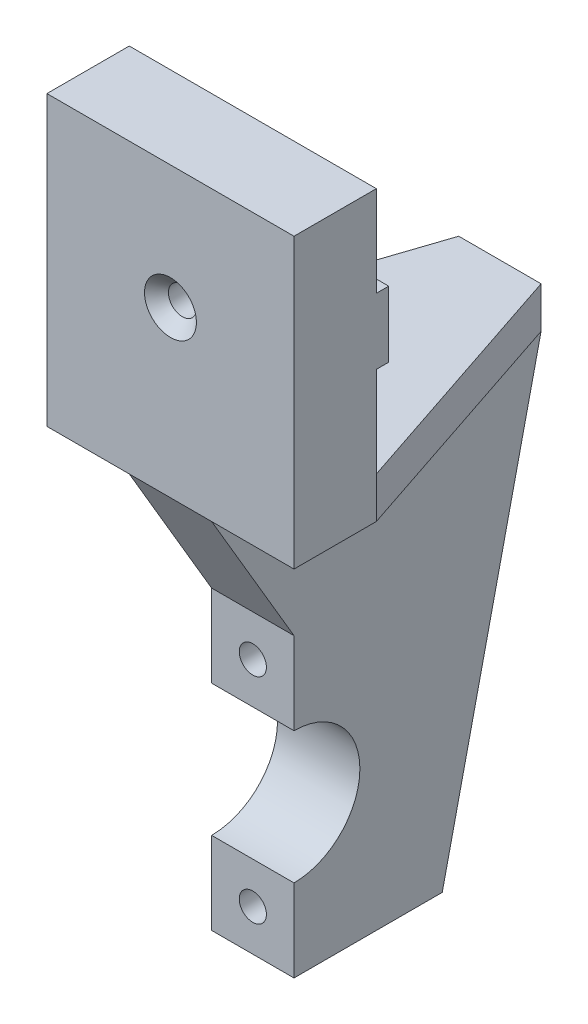
ISO-10303-21;
HEADER;
FILE_DESCRIPTION(('STEP AP214'),'2;1');
FILE_NAME('part.step','',(''),(''),'','','');
FILE_SCHEMA(('AUTOMOTIVE_DESIGN { 1 0 10303 214 1 1 1 1 }'));
ENDSEC;
DATA;
#1=APPLICATION_CONTEXT('core data for automotive mechanical design processes');
#2=APPLICATION_PROTOCOL_DEFINITION('international standard','automotive_design',2000,#1);
#3=PRODUCT_CONTEXT('',#1,'mechanical');
#4=PRODUCT('Part','Part','',(#3));
#5=PRODUCT_RELATED_PRODUCT_CATEGORY('part','',(#4));
#6=PRODUCT_DEFINITION_FORMATION('','',#4);
#7=PRODUCT_DEFINITION_CONTEXT('part definition',#1,'design');
#8=PRODUCT_DEFINITION('design','',#6,#7);
#9=PRODUCT_DEFINITION_SHAPE('','',#8);
#10=(LENGTH_UNIT() NAMED_UNIT(*) SI_UNIT(.MILLI.,.METRE.));
#11=(NAMED_UNIT(*) PLANE_ANGLE_UNIT() SI_UNIT($,.RADIAN.));
#12=(NAMED_UNIT(*) SI_UNIT($,.STERADIAN.) SOLID_ANGLE_UNIT());
#13=UNCERTAINTY_MEASURE_WITH_UNIT(LENGTH_MEASURE(1.E-05),#10,'distance_accuracy_value','');
#14=(GEOMETRIC_REPRESENTATION_CONTEXT(3) GLOBAL_UNCERTAINTY_ASSIGNED_CONTEXT((#13)) GLOBAL_UNIT_ASSIGNED_CONTEXT((#10,
#11,#12)) REPRESENTATION_CONTEXT('',''));
#15=CARTESIAN_POINT('',(0.,0.,0.));
#16=DIRECTION('',(0.,0.,1.));
#17=DIRECTION('',(1.,0.,0.));
#18=AXIS2_PLACEMENT_3D('',#15,#16,#17);
#19=CARTESIAN_POINT('',(0.,0.,0.));
#20=DIRECTION('',(0.,0.,1.));
#21=DIRECTION('',(1.,0.,0.));
#22=AXIS2_PLACEMENT_3D('',#19,#20,#21);
#23=PLANE('',#22);
#24=CARTESIAN_POINT('',(15.,15.,0.));
#25=DIRECTION('',(0.,0.,1.));
#26=DIRECTION('',(1.,0.,0.));
#27=AXIS2_PLACEMENT_3D('',#24,#25,#26);
#28=CIRCLE('',#27,1.7);
#29=CARTESIAN_POINT('',(16.7,15.,0.));
#30=VERTEX_POINT('',#29);
#31=EDGE_CURVE('E198',#30,#30,#28,.T.);
#32=ORIENTED_EDGE('',*,*,#31,.T.);
#33=EDGE_LOOP('',(#32));
#34=FACE_BOUND('',#33,.T.);
#35=DIRECTION('',(1.,0.,0.));
#36=VECTOR('',#35,1.);
#37=CARTESIAN_POINT('',(0.,19.,0.));
#38=LINE('',#37,#36);
#39=CARTESIAN_POINT('',(0.,19.,0.));
#40=VERTEX_POINT('',#39);
#41=CARTESIAN_POINT('',(5.,19.,0.));
#42=VERTEX_POINT('',#41);
#43=EDGE_CURVE('E229',#40,#42,#38,.T.);
#44=ORIENTED_EDGE('',*,*,#43,.F.);
#45=DIRECTION('',(0.,-1.,0.));
#46=VECTOR('',#45,1.);
#47=CARTESIAN_POINT('',(0.,30.,0.));
#48=LINE('',#47,#46);
#49=CARTESIAN_POINT('',(0.,30.,0.));
#50=VERTEX_POINT('',#49);
#51=EDGE_CURVE('E348',#50,#40,#48,.T.);
#52=ORIENTED_EDGE('',*,*,#51,.F.);
#53=DIRECTION('',(-1.,0.,0.));
#54=VECTOR('',#53,1.);
#55=CARTESIAN_POINT('',(0.,30.,0.));
#56=LINE('',#55,#54);
#57=CARTESIAN_POINT('',(30.,30.,0.));
#58=VERTEX_POINT('',#57);
#59=EDGE_CURVE('E343',#58,#50,#56,.T.);
#60=ORIENTED_EDGE('',*,*,#59,.F.);
#61=DIRECTION('',(0.,1.,0.));
#62=VECTOR('',#61,1.);
#63=CARTESIAN_POINT('',(30.,30.,0.));
#64=LINE('',#63,#62);
#65=CARTESIAN_POINT('',(30.,19.,0.));
#66=VERTEX_POINT('',#65);
#67=EDGE_CURVE('E354',#66,#58,#64,.T.);
#68=ORIENTED_EDGE('',*,*,#67,.F.);
#69=DIRECTION('',(1.,0.,0.));
#70=VECTOR('',#69,1.);
#71=CARTESIAN_POINT('',(0.,19.,0.));
#72=LINE('',#71,#70);
#73=CARTESIAN_POINT('',(25.,19.,0.));
#74=VERTEX_POINT('',#73);
#75=EDGE_CURVE('E364',#74,#66,#72,.T.);
#76=ORIENTED_EDGE('',*,*,#75,.F.);
#77=DIRECTION('',(0.,1.,0.));
#78=VECTOR('',#77,1.);
#79=CARTESIAN_POINT('',(25.,0.,0.));
#80=LINE('',#79,#78);
#81=CARTESIAN_POINT('',(25.,11.,0.));
#82=VERTEX_POINT('',#81);
#83=EDGE_CURVE('E367',#82,#74,#80,.T.);
#84=ORIENTED_EDGE('',*,*,#83,.F.);
#85=DIRECTION('',(-1.,0.,0.));
#86=VECTOR('',#85,1.);
#87=CARTESIAN_POINT('',(0.,11.,0.));
#88=LINE('',#87,#86);
#89=CARTESIAN_POINT('',(30.,11.,0.));
#90=VERTEX_POINT('',#89);
#91=EDGE_CURVE('E43',#90,#82,#88,.T.);
#92=ORIENTED_EDGE('',*,*,#91,.F.);
#93=CARTESIAN_POINT('',(30.,0.,0.));
#94=VERTEX_POINT('',#93);
#95=EDGE_CURVE('E355',#94,#90,#64,.T.);
#96=ORIENTED_EDGE('',*,*,#95,.F.);
#97=DIRECTION('',(1.,0.,0.));
#98=VECTOR('',#97,1.);
#99=CARTESIAN_POINT('',(0.,0.,0.));
#100=LINE('',#99,#98);
#101=CARTESIAN_POINT('',(0.,0.,0.));
#102=VERTEX_POINT('',#101);
#103=EDGE_CURVE('E351',#102,#94,#100,.T.);
#104=ORIENTED_EDGE('',*,*,#103,.F.);
#105=CARTESIAN_POINT('',(0.,11.,0.));
#106=VERTEX_POINT('',#105);
#107=EDGE_CURVE('E338',#106,#102,#48,.T.);
#108=ORIENTED_EDGE('',*,*,#107,.F.);
#109=DIRECTION('',(-1.,0.,0.));
#110=VECTOR('',#109,1.);
#111=CARTESIAN_POINT('',(0.,11.,0.));
#112=LINE('',#111,#110);
#113=CARTESIAN_POINT('',(5.,11.,0.));
#114=VERTEX_POINT('',#113);
#115=EDGE_CURVE('E53',#114,#106,#112,.T.);
#116=ORIENTED_EDGE('',*,*,#115,.F.);
#117=DIRECTION('',(0.,-1.,0.));
#118=VECTOR('',#117,1.);
#119=CARTESIAN_POINT('',(5.,0.,0.));
#120=LINE('',#119,#118);
#121=EDGE_CURVE('E11',#42,#114,#120,.T.);
#122=ORIENTED_EDGE('',*,*,#121,.F.);
#123=EDGE_LOOP('',(#44,#52,#60,#68,#76,#84,#92,#96,#104,#108,#116,#122));
#124=FACE_BOUND('',#123,.T.);
#125=ADVANCED_FACE('F35',(#34,#124),#23,.F.);
#126=CARTESIAN_POINT('',(0.,-5.,0.));
#127=DIRECTION('',(0.,-1.,0.));
#128=DIRECTION('',(0.,0.,-1.));
#129=AXIS2_PLACEMENT_3D('',#126,#127,#128);
#130=PLANE('',#129);
#131=DIRECTION('',(0.316227766016838,0.,-0.948683298050514));
#132=VECTOR('',#131,1.);
#133=CARTESIAN_POINT('',(0.,-5.,0.));
#134=LINE('',#133,#132);
#135=CARTESIAN_POINT('',(0.,-5.,0.));
#136=VERTEX_POINT('',#135);
#137=CARTESIAN_POINT('',(10.,-5.,-30.));
#138=VERTEX_POINT('',#137);
#139=EDGE_CURVE('E307',#136,#138,#134,.T.);
#140=ORIENTED_EDGE('',*,*,#139,.T.);
#141=DIRECTION('',(0.,0.,1.));
#142=VECTOR('',#141,1.);
#143=CARTESIAN_POINT('',(10.,-5.,10.));
#144=LINE('',#143,#142);
#145=CARTESIAN_POINT('',(10.,-5.,10.));
#146=VERTEX_POINT('',#145);
#147=EDGE_CURVE('E281',#138,#146,#144,.T.);
#148=ORIENTED_EDGE('',*,*,#147,.T.);
#149=DIRECTION('',(-1.,0.,0.));
#150=VECTOR('',#149,1.);
#151=CARTESIAN_POINT('',(0.,-5.,10.));
#152=LINE('',#151,#150);
#153=CARTESIAN_POINT('',(0.,-5.,10.));
#154=VERTEX_POINT('',#153);
#155=EDGE_CURVE('E318',#146,#154,#152,.T.);
#156=ORIENTED_EDGE('',*,*,#155,.T.);
#157=DIRECTION('',(0.,0.,-1.));
#158=VECTOR('',#157,1.);
#159=CARTESIAN_POINT('',(0.,-5.,10.));
#160=LINE('',#159,#158);
#161=EDGE_CURVE('E304',#154,#136,#160,.T.);
#162=ORIENTED_EDGE('',*,*,#161,.T.);
#163=EDGE_LOOP('',(#140,#148,#156,#162));
#164=FACE_BOUND('',#163,.T.);
#165=ADVANCED_FACE('F438',(#164),#130,.T.);
#166=CARTESIAN_POINT('',(0.,30.,10.));
#167=DIRECTION('',(1.,0.,0.));
#168=DIRECTION('',(0.,0.,-1.));
#169=AXIS2_PLACEMENT_3D('',#166,#167,#168);
#170=PLANE('',#169);
#171=ORIENTED_EDGE('',*,*,#51,.T.);
#172=DIRECTION('',(0.,0.,1.));
#173=VECTOR('',#172,1.);
#174=CARTESIAN_POINT('',(0.,19.,-1.5));
#175=LINE('',#174,#173);
#176=CARTESIAN_POINT('',(0.,19.,-1.5));
#177=VERTEX_POINT('',#176);
#178=EDGE_CURVE('E225',#177,#40,#175,.T.);
#179=ORIENTED_EDGE('',*,*,#178,.F.);
#180=DIRECTION('',(0.,1.,0.));
#181=VECTOR('',#180,1.);
#182=CARTESIAN_POINT('',(0.,19.,-1.5));
#183=LINE('',#182,#181);
#184=CARTESIAN_POINT('',(0.,11.,-1.5));
#185=VERTEX_POINT('',#184);
#186=EDGE_CURVE('E207',#185,#177,#183,.T.);
#187=ORIENTED_EDGE('',*,*,#186,.F.);
#188=DIRECTION('',(0.,0.,1.));
#189=VECTOR('',#188,1.);
#190=CARTESIAN_POINT('',(0.,11.,-1.5));
#191=LINE('',#190,#189);
#192=EDGE_CURVE('E216',#185,#106,#191,.T.);
#193=ORIENTED_EDGE('',*,*,#192,.T.);
#194=ORIENTED_EDGE('',*,*,#107,.T.);
#195=DIRECTION('',(0.,1.,0.));
#196=VECTOR('',#195,1.);
#197=CARTESIAN_POINT('',(0.,-5.,0.));
#198=LINE('',#197,#196);
#199=EDGE_CURVE('E335',#136,#102,#198,.T.);
#200=ORIENTED_EDGE('',*,*,#199,.F.);
#201=ORIENTED_EDGE('',*,*,#161,.F.);
#202=DIRECTION('',(0.,-1.,0.));
#203=VECTOR('',#202,1.);
#204=CARTESIAN_POINT('',(0.,30.,10.));
#205=LINE('',#204,#203);
#206=CARTESIAN_POINT('',(0.,30.,10.));
#207=VERTEX_POINT('',#206);
#208=EDGE_CURVE('E339',#207,#154,#205,.T.);
#209=ORIENTED_EDGE('',*,*,#208,.F.);
#210=DIRECTION('',(0.,0.,-1.));
#211=VECTOR('',#210,1.);
#212=CARTESIAN_POINT('',(0.,30.,10.));
#213=LINE('',#212,#211);
#214=EDGE_CURVE('E347',#207,#50,#213,.T.);
#215=ORIENTED_EDGE('',*,*,#214,.T.);
#216=EDGE_LOOP('',(#171,#179,#187,#193,#194,#200,#201,#209,#215));
#217=FACE_BOUND('',#216,.T.);
#218=ADVANCED_FACE('F37',(#217),#170,.F.);
#219=CARTESIAN_POINT('',(30.,30.,10.));
#220=DIRECTION('',(-1.,0.,0.));
#221=DIRECTION('',(0.,-1.,0.));
#222=AXIS2_PLACEMENT_3D('',#219,#220,#221);
#223=PLANE('',#222);
#224=ORIENTED_EDGE('',*,*,#95,.T.);
#225=DIRECTION('',(0.,0.,1.));
#226=VECTOR('',#225,1.);
#227=CARTESIAN_POINT('',(30.,11.,-1.5));
#228=LINE('',#227,#226);
#229=CARTESIAN_POINT('',(30.,11.,-1.5));
#230=VERTEX_POINT('',#229);
#231=EDGE_CURVE('E249',#230,#90,#228,.T.);
#232=ORIENTED_EDGE('',*,*,#231,.F.);
#233=DIRECTION('',(0.,-1.,0.));
#234=VECTOR('',#233,1.);
#235=CARTESIAN_POINT('',(30.,19.,-1.5));
#236=LINE('',#235,#234);
#237=CARTESIAN_POINT('',(30.,19.,-1.5));
#238=VERTEX_POINT('',#237);
#239=EDGE_CURVE('E231',#238,#230,#236,.T.);
#240=ORIENTED_EDGE('',*,*,#239,.F.);
#241=DIRECTION('',(0.,0.,1.));
#242=VECTOR('',#241,1.);
#243=CARTESIAN_POINT('',(30.,19.,-1.5));
#244=LINE('',#243,#242);
#245=EDGE_CURVE('E240',#238,#66,#244,.T.);
#246=ORIENTED_EDGE('',*,*,#245,.T.);
#247=ORIENTED_EDGE('',*,*,#67,.T.);
#248=DIRECTION('',(0.,0.,-1.));
#249=VECTOR('',#248,1.);
#250=CARTESIAN_POINT('',(30.,30.,10.));
#251=LINE('',#250,#249);
#252=CARTESIAN_POINT('',(30.,30.,10.));
#253=VERTEX_POINT('',#252);
#254=EDGE_CURVE('E361',#253,#58,#251,.T.);
#255=ORIENTED_EDGE('',*,*,#254,.F.);
#256=DIRECTION('',(0.,1.,0.));
#257=VECTOR('',#256,1.);
#258=CARTESIAN_POINT('',(30.,30.,10.));
#259=LINE('',#258,#257);
#260=CARTESIAN_POINT('',(30.,-5.,10.));
#261=VERTEX_POINT('',#260);
#262=EDGE_CURVE('E342',#261,#253,#259,.T.);
#263=ORIENTED_EDGE('',*,*,#262,.F.);
#264=DIRECTION('',(0.,0.,1.));
#265=VECTOR('',#264,1.);
#266=CARTESIAN_POINT('',(30.,-5.,10.));
#267=LINE('',#266,#265);
#268=CARTESIAN_POINT('',(30.,-5.,0.));
#269=VERTEX_POINT('',#268);
#270=EDGE_CURVE('E315',#269,#261,#267,.T.);
#271=ORIENTED_EDGE('',*,*,#270,.F.);
#272=DIRECTION('',(0.,1.,0.));
#273=VECTOR('',#272,1.);
#274=CARTESIAN_POINT('',(30.,-5.,0.));
#275=LINE('',#274,#273);
#276=EDGE_CURVE('E321',#269,#94,#275,.T.);
#277=ORIENTED_EDGE('',*,*,#276,.T.);
#278=EDGE_LOOP('',(#224,#232,#240,#246,#247,#255,#263,#271,#277));
#279=FACE_BOUND('',#278,.T.);
#280=ADVANCED_FACE('F384',(#279),#223,.F.);
#281=CARTESIAN_POINT('',(0.,30.,10.));
#282=DIRECTION('',(0.,-1.,0.));
#283=DIRECTION('',(0.,0.,-1.));
#284=AXIS2_PLACEMENT_3D('',#281,#282,#283);
#285=PLANE('',#284);
#286=ORIENTED_EDGE('',*,*,#59,.T.);
#287=ORIENTED_EDGE('',*,*,#214,.F.);
#288=DIRECTION('',(-1.,0.,0.));
#289=VECTOR('',#288,1.);
#290=CARTESIAN_POINT('',(0.,30.,10.));
#291=LINE('',#290,#289);
#292=EDGE_CURVE('E345',#253,#207,#291,.T.);
#293=ORIENTED_EDGE('',*,*,#292,.F.);
#294=ORIENTED_EDGE('',*,*,#254,.T.);
#295=EDGE_LOOP('',(#286,#287,#293,#294));
#296=FACE_BOUND('',#295,.T.);
#297=ADVANCED_FACE('F425',(#296),#285,.F.);
#298=CARTESIAN_POINT('',(0.,0.,10.));
#299=DIRECTION('',(0.,0.,1.));
#300=DIRECTION('',(1.,0.,0.));
#301=AXIS2_PLACEMENT_3D('',#298,#299,#300);
#302=PLANE('',#301);
#303=CARTESIAN_POINT('',(15.,15.,10.));
#304=DIRECTION('',(0.,0.,1.));
#305=DIRECTION('',(1.,0.,0.));
#306=AXIS2_PLACEMENT_3D('',#303,#304,#305);
#307=CIRCLE('',#306,3.15);
#308=CARTESIAN_POINT('',(18.15,15.,10.));
#309=VERTEX_POINT('',#308);
#310=EDGE_CURVE('E204',#309,#309,#307,.T.);
#311=ORIENTED_EDGE('',*,*,#310,.F.);
#312=EDGE_LOOP('',(#311));
#313=FACE_BOUND('',#312,.T.);
#314=ORIENTED_EDGE('',*,*,#208,.T.);
#315=ORIENTED_EDGE('',*,*,#155,.F.);
#316=DIRECTION('',(-1.,0.,0.));
#317=VECTOR('',#316,1.);
#318=CARTESIAN_POINT('',(20.,-5.,10.));
#319=LINE('',#318,#317);
#320=CARTESIAN_POINT('',(20.,-5.,10.));
#321=VERTEX_POINT('',#320);
#322=EDGE_CURVE('E291',#321,#146,#319,.T.);
#323=ORIENTED_EDGE('',*,*,#322,.F.);
#324=EDGE_CURVE('E319',#261,#321,#152,.T.);
#325=ORIENTED_EDGE('',*,*,#324,.F.);
#326=ORIENTED_EDGE('',*,*,#262,.T.);
#327=ORIENTED_EDGE('',*,*,#292,.T.);
#328=EDGE_LOOP('',(#314,#315,#323,#325,#326,#327));
#329=FACE_BOUND('',#328,.T.);
#330=ADVANCED_FACE('F449',(#313,#329),#302,.T.);
#331=CARTESIAN_POINT('',(0.,0.,0.));
#332=DIRECTION('',(0.,-1.,0.));
#333=DIRECTION('',(0.,0.,-1.));
#334=AXIS2_PLACEMENT_3D('',#331,#332,#333);
#335=PLANE('',#334);
#336=DIRECTION('',(0.316227766016838,0.,-0.948683298050514));
#337=VECTOR('',#336,1.);
#338=CARTESIAN_POINT('',(0.,0.,0.));
#339=LINE('',#338,#337);
#340=CARTESIAN_POINT('',(10.,0.,-30.));
#341=VERTEX_POINT('',#340);
#342=EDGE_CURVE('E303',#102,#341,#339,.T.);
#343=ORIENTED_EDGE('',*,*,#342,.F.);
#344=ORIENTED_EDGE('',*,*,#103,.T.);
#345=DIRECTION('',(0.316227766016838,0.,0.948683298050514));
#346=VECTOR('',#345,1.);
#347=CARTESIAN_POINT('',(20.,0.,-30.));
#348=LINE('',#347,#346);
#349=CARTESIAN_POINT('',(20.,0.,-30.));
#350=VERTEX_POINT('',#349);
#351=EDGE_CURVE('E308',#350,#94,#348,.T.);
#352=ORIENTED_EDGE('',*,*,#351,.F.);
#353=DIRECTION('',(1.,0.,0.));
#354=VECTOR('',#353,1.);
#355=CARTESIAN_POINT('',(10.,0.,-30.));
#356=LINE('',#355,#354);
#357=EDGE_CURVE('E323',#341,#350,#356,.T.);
#358=ORIENTED_EDGE('',*,*,#357,.F.);
#359=EDGE_LOOP('',(#343,#344,#352,#358));
#360=FACE_BOUND('',#359,.T.);
#361=ADVANCED_FACE('F391',(#360),#335,.F.);
#362=CARTESIAN_POINT('',(0.,-5.,0.));
#363=DIRECTION('',(0.948683298050514,0.,0.316227766016838));
#364=DIRECTION('',(0.316227766016838,0.,-0.948683298050514));
#365=AXIS2_PLACEMENT_3D('',#362,#363,#364);
#366=PLANE('',#365);
#367=ORIENTED_EDGE('',*,*,#342,.T.);
#368=DIRECTION('',(0.,1.,0.));
#369=VECTOR('',#368,1.);
#370=CARTESIAN_POINT('',(10.,-5.,-30.));
#371=LINE('',#370,#369);
#372=EDGE_CURVE('E332',#138,#341,#371,.T.);
#373=ORIENTED_EDGE('',*,*,#372,.F.);
#374=ORIENTED_EDGE('',*,*,#139,.F.);
#375=ORIENTED_EDGE('',*,*,#199,.T.);
#376=EDGE_LOOP('',(#367,#373,#374,#375));
#377=FACE_BOUND('',#376,.T.);
#378=ADVANCED_FACE('F402',(#377),#366,.F.);
#379=CARTESIAN_POINT('',(10.,-5.,-30.));
#380=DIRECTION('',(0.,0.,1.));
#381=DIRECTION('',(1.,0.,0.));
#382=AXIS2_PLACEMENT_3D('',#379,#380,#381);
#383=PLANE('',#382);
#384=ORIENTED_EDGE('',*,*,#357,.T.);
#385=DIRECTION('',(0.,1.,0.));
#386=VECTOR('',#385,1.);
#387=CARTESIAN_POINT('',(20.,-5.,-30.));
#388=LINE('',#387,#386);
#389=CARTESIAN_POINT('',(20.,-5.,-30.));
#390=VERTEX_POINT('',#389);
#391=EDGE_CURVE('E329',#390,#350,#388,.T.);
#392=ORIENTED_EDGE('',*,*,#391,.F.);
#393=DIRECTION('',(1.,0.,0.));
#394=VECTOR('',#393,1.);
#395=CARTESIAN_POINT('',(10.,-5.,-30.));
#396=LINE('',#395,#394);
#397=EDGE_CURVE('E310',#138,#390,#396,.T.);
#398=ORIENTED_EDGE('',*,*,#397,.F.);
#399=ORIENTED_EDGE('',*,*,#372,.T.);
#400=EDGE_LOOP('',(#384,#392,#398,#399));
#401=FACE_BOUND('',#400,.T.);
#402=ADVANCED_FACE('F399',(#401),#383,.F.);
#403=CARTESIAN_POINT('',(20.,-5.,-30.));
#404=DIRECTION('',(-0.948683298050514,0.,0.316227766016838));
#405=DIRECTION('',(0.316227766016838,0.,0.948683298050514));
#406=AXIS2_PLACEMENT_3D('',#403,#404,#405);
#407=PLANE('',#406);
#408=ORIENTED_EDGE('',*,*,#351,.T.);
#409=ORIENTED_EDGE('',*,*,#276,.F.);
#410=DIRECTION('',(0.316227766016838,0.,0.948683298050514));
#411=VECTOR('',#410,1.);
#412=CARTESIAN_POINT('',(20.,-5.,-30.));
#413=LINE('',#412,#411);
#414=EDGE_CURVE('E313',#390,#269,#413,.T.);
#415=ORIENTED_EDGE('',*,*,#414,.F.);
#416=ORIENTED_EDGE('',*,*,#391,.T.);
#417=EDGE_LOOP('',(#408,#409,#415,#416));
#418=FACE_BOUND('',#417,.T.);
#419=ADVANCED_FACE('F394',(#418),#407,.F.);
#420=DIRECTION('',(0.,0.,1.));
#421=VECTOR('',#420,1.);
#422=CARTESIAN_POINT('',(20.,-5.,10.));
#423=LINE('',#422,#421);
#424=EDGE_CURVE('E264',#390,#321,#423,.T.);
#425=ORIENTED_EDGE('',*,*,#424,.F.);
#426=ORIENTED_EDGE('',*,*,#414,.T.);
#427=ORIENTED_EDGE('',*,*,#270,.T.);
#428=ORIENTED_EDGE('',*,*,#324,.T.);
#429=EDGE_LOOP('',(#425,#426,#427,#428));
#430=FACE_BOUND('',#429,.T.);
#431=ADVANCED_FACE('F446',(#430),#130,.T.);
#432=CARTESIAN_POINT('',(20.,-40.,0.));
#433=DIRECTION('',(-1.,0.,0.));
#434=DIRECTION('',(0.,-1.,0.));
#435=AXIS2_PLACEMENT_3D('',#432,#433,#434);
#436=CYLINDRICAL_SURFACE('',#435,8.);
#437=CARTESIAN_POINT('',(10.,-40.,0.));
#438=DIRECTION('',(-1.,0.,0.));
#439=DIRECTION('',(0.,1.,0.));
#440=AXIS2_PLACEMENT_3D('',#437,#438,#439);
#441=CIRCLE('',#440,8.);
#442=CARTESIAN_POINT('',(10.,-32.,0.));
#443=VERTEX_POINT('',#442);
#444=CARTESIAN_POINT('',(10.,-48.,0.));
#445=VERTEX_POINT('',#444);
#446=EDGE_CURVE('E252',#443,#445,#441,.T.);
#447=ORIENTED_EDGE('',*,*,#446,.T.);
#448=DIRECTION('',(-1.,0.,0.));
#449=VECTOR('',#448,1.);
#450=CARTESIAN_POINT('',(20.,-48.,0.));
#451=LINE('',#450,#449);
#452=CARTESIAN_POINT('',(20.,-48.,0.));
#453=VERTEX_POINT('',#452);
#454=EDGE_CURVE('E300',#453,#445,#451,.T.);
#455=ORIENTED_EDGE('',*,*,#454,.F.);
#456=CARTESIAN_POINT('',(20.,-40.,0.));
#457=DIRECTION('',(-1.,0.,0.));
#458=DIRECTION('',(0.,1.,0.));
#459=AXIS2_PLACEMENT_3D('',#456,#457,#458);
#460=CIRCLE('',#459,8.);
#461=CARTESIAN_POINT('',(20.,-32.,0.));
#462=VERTEX_POINT('',#461);
#463=EDGE_CURVE('E253',#462,#453,#460,.T.);
#464=ORIENTED_EDGE('',*,*,#463,.F.);
#465=DIRECTION('',(-1.,0.,0.));
#466=VECTOR('',#465,1.);
#467=CARTESIAN_POINT('',(20.,-32.,0.));
#468=LINE('',#467,#466);
#469=EDGE_CURVE('E271',#462,#443,#468,.T.);
#470=ORIENTED_EDGE('',*,*,#469,.T.);
#471=EDGE_LOOP('',(#447,#455,#464,#470));
#472=FACE_BOUND('',#471,.T.);
#473=ADVANCED_FACE('F501',(#472),#436,.F.);
#474=CARTESIAN_POINT('',(20.,-48.,0.));
#475=DIRECTION('',(0.,0.,-1.));
#476=DIRECTION('',(0.,1.,0.));
#477=AXIS2_PLACEMENT_3D('',#474,#475,#476);
#478=PLANE('',#477);
#479=CARTESIAN_POINT('',(15.,-53.,0.));
#480=DIRECTION('',(0.,0.,1.));
#481=DIRECTION('',(1.,0.,0.));
#482=AXIS2_PLACEMENT_3D('',#479,#480,#481);
#483=CIRCLE('',#482,1.65);
#484=CARTESIAN_POINT('',(16.65,-53.,0.));
#485=VERTEX_POINT('',#484);
#486=EDGE_CURVE('E195',#485,#485,#483,.T.);
#487=ORIENTED_EDGE('',*,*,#486,.F.);
#488=EDGE_LOOP('',(#487));
#489=FACE_BOUND('',#488,.T.);
#490=DIRECTION('',(0.,-1.,0.));
#491=VECTOR('',#490,1.);
#492=CARTESIAN_POINT('',(10.,-48.,0.));
#493=LINE('',#492,#491);
#494=CARTESIAN_POINT('',(10.,-58.,0.));
#495=VERTEX_POINT('',#494);
#496=EDGE_CURVE('E274',#445,#495,#493,.T.);
#497=ORIENTED_EDGE('',*,*,#496,.T.);
#498=DIRECTION('',(-1.,0.,0.));
#499=VECTOR('',#498,1.);
#500=CARTESIAN_POINT('',(20.,-58.,0.));
#501=LINE('',#500,#499);
#502=CARTESIAN_POINT('',(20.,-58.,0.));
#503=VERTEX_POINT('',#502);
#504=EDGE_CURVE('E297',#503,#495,#501,.T.);
#505=ORIENTED_EDGE('',*,*,#504,.F.);
#506=DIRECTION('',(0.,-1.,0.));
#507=VECTOR('',#506,1.);
#508=CARTESIAN_POINT('',(20.,-48.,0.));
#509=LINE('',#508,#507);
#510=EDGE_CURVE('E256',#453,#503,#509,.T.);
#511=ORIENTED_EDGE('',*,*,#510,.F.);
#512=ORIENTED_EDGE('',*,*,#454,.T.);
#513=EDGE_LOOP('',(#497,#505,#511,#512));
#514=FACE_BOUND('',#513,.T.);
#515=ADVANCED_FACE('F509',(#489,#514),#478,.F.);
#516=CARTESIAN_POINT('',(20.,-58.,0.));
#517=DIRECTION('',(0.,1.,0.));
#518=DIRECTION('',(-1.,0.,0.));
#519=AXIS2_PLACEMENT_3D('',#516,#517,#518);
#520=PLANE('',#519);
#521=DIRECTION('',(0.,0.,-1.));
#522=VECTOR('',#521,1.);
#523=CARTESIAN_POINT('',(10.,-58.,0.));
#524=LINE('',#523,#522);
#525=CARTESIAN_POINT('',(10.,-58.,-18.));
#526=VERTEX_POINT('',#525);
#527=EDGE_CURVE('E276',#495,#526,#524,.T.);
#528=ORIENTED_EDGE('',*,*,#527,.T.);
#529=DIRECTION('',(-1.,0.,0.));
#530=VECTOR('',#529,1.);
#531=CARTESIAN_POINT('',(20.,-58.,-18.));
#532=LINE('',#531,#530);
#533=CARTESIAN_POINT('',(20.,-58.,-18.));
#534=VERTEX_POINT('',#533);
#535=EDGE_CURVE('E294',#534,#526,#532,.T.);
#536=ORIENTED_EDGE('',*,*,#535,.F.);
#537=DIRECTION('',(0.,0.,-1.));
#538=VECTOR('',#537,1.);
#539=CARTESIAN_POINT('',(20.,-58.,0.));
#540=LINE('',#539,#538);
#541=EDGE_CURVE('E259',#503,#534,#540,.T.);
#542=ORIENTED_EDGE('',*,*,#541,.F.);
#543=ORIENTED_EDGE('',*,*,#504,.T.);
#544=EDGE_LOOP('',(#528,#536,#542,#543));
#545=FACE_BOUND('',#544,.T.);
#546=ADVANCED_FACE('F517',(#545),#520,.F.);
#547=CARTESIAN_POINT('',(20.,-58.,-18.));
#548=DIRECTION('',(0.,0.220825652597795,0.975313298973595));
#549=DIRECTION('',(0.,-0.975313298973595,0.220825652597795));
#550=AXIS2_PLACEMENT_3D('',#547,#548,#549);
#551=PLANE('',#550);
#552=DIRECTION('',(0.,0.975313298973595,-0.220825652597795));
#553=VECTOR('',#552,1.);
#554=CARTESIAN_POINT('',(10.,-58.,-18.));
#555=LINE('',#554,#553);
#556=EDGE_CURVE('E278',#526,#138,#555,.T.);
#557=ORIENTED_EDGE('',*,*,#556,.T.);
#558=ORIENTED_EDGE('',*,*,#397,.T.);
#559=DIRECTION('',(0.,0.975313298973595,-0.220825652597795));
#560=VECTOR('',#559,1.);
#561=CARTESIAN_POINT('',(20.,-58.,-18.));
#562=LINE('',#561,#560);
#563=EDGE_CURVE('E261',#534,#390,#562,.T.);
#564=ORIENTED_EDGE('',*,*,#563,.F.);
#565=ORIENTED_EDGE('',*,*,#535,.T.);
#566=EDGE_LOOP('',(#557,#558,#564,#565));
#567=FACE_BOUND('',#566,.T.);
#568=ADVANCED_FACE('F522',(#567),#551,.F.);
#569=CARTESIAN_POINT('',(20.,-5.,10.));
#570=DIRECTION('',(0.,0.507020126563394,-0.861934215157769));
#571=DIRECTION('',(0.,0.86193421515777,0.507020126563394));
#572=AXIS2_PLACEMENT_3D('',#569,#570,#571);
#573=PLANE('',#572);
#574=DIRECTION('',(0.,-0.86193421515777,-0.507020126563394));
#575=VECTOR('',#574,1.);
#576=CARTESIAN_POINT('',(10.,-5.,10.));
#577=LINE('',#576,#575);
#578=CARTESIAN_POINT('',(10.,-22.,0.));
#579=VERTEX_POINT('',#578);
#580=EDGE_CURVE('E283',#146,#579,#577,.T.);
#581=ORIENTED_EDGE('',*,*,#580,.T.);
#582=DIRECTION('',(-1.,0.,0.));
#583=VECTOR('',#582,1.);
#584=CARTESIAN_POINT('',(20.,-22.,0.));
#585=LINE('',#584,#583);
#586=CARTESIAN_POINT('',(20.,-22.,0.));
#587=VERTEX_POINT('',#586);
#588=EDGE_CURVE('E288',#587,#579,#585,.T.);
#589=ORIENTED_EDGE('',*,*,#588,.F.);
#590=DIRECTION('',(0.,-0.86193421515777,-0.507020126563394));
#591=VECTOR('',#590,1.);
#592=CARTESIAN_POINT('',(20.,-5.,10.));
#593=LINE('',#592,#591);
#594=EDGE_CURVE('E267',#321,#587,#593,.T.);
#595=ORIENTED_EDGE('',*,*,#594,.F.);
#596=ORIENTED_EDGE('',*,*,#322,.T.);
#597=EDGE_LOOP('',(#581,#589,#595,#596));
#598=FACE_BOUND('',#597,.T.);
#599=ADVANCED_FACE('F532',(#598),#573,.F.);
#600=CARTESIAN_POINT('',(20.,-32.,0.));
#601=DIRECTION('',(0.,0.,-1.));
#602=DIRECTION('',(-1.,0.,0.));
#603=AXIS2_PLACEMENT_3D('',#600,#601,#602);
#604=PLANE('',#603);
#605=CARTESIAN_POINT('',(15.,-27.,0.));
#606=DIRECTION('',(0.,0.,1.));
#607=DIRECTION('',(1.,0.,0.));
#608=AXIS2_PLACEMENT_3D('',#605,#606,#607);
#609=CIRCLE('',#608,1.65);
#610=CARTESIAN_POINT('',(16.65,-27.,0.));
#611=VERTEX_POINT('',#610);
#612=EDGE_CURVE('E187',#611,#611,#609,.T.);
#613=ORIENTED_EDGE('',*,*,#612,.F.);
#614=EDGE_LOOP('',(#613));
#615=FACE_BOUND('',#614,.T.);
#616=DIRECTION('',(0.,-1.,0.));
#617=VECTOR('',#616,1.);
#618=CARTESIAN_POINT('',(10.,-32.,0.));
#619=LINE('',#618,#617);
#620=EDGE_CURVE('E257',#579,#443,#619,.T.);
#621=ORIENTED_EDGE('',*,*,#620,.T.);
#622=ORIENTED_EDGE('',*,*,#469,.F.);
#623=DIRECTION('',(0.,-1.,0.));
#624=VECTOR('',#623,1.);
#625=CARTESIAN_POINT('',(20.,-32.,0.));
#626=LINE('',#625,#624);
#627=EDGE_CURVE('E269',#587,#462,#626,.T.);
#628=ORIENTED_EDGE('',*,*,#627,.F.);
#629=ORIENTED_EDGE('',*,*,#588,.T.);
#630=EDGE_LOOP('',(#621,#622,#628,#629));
#631=FACE_BOUND('',#630,.T.);
#632=ADVANCED_FACE('F542',(#615,#631),#604,.F.);
#633=CARTESIAN_POINT('',(20.,-40.,0.));
#634=DIRECTION('',(1.,0.,0.));
#635=DIRECTION('',(0.,1.,0.));
#636=AXIS2_PLACEMENT_3D('',#633,#634,#635);
#637=PLANE('',#636);
#638=ORIENTED_EDGE('',*,*,#463,.T.);
#639=ORIENTED_EDGE('',*,*,#510,.T.);
#640=ORIENTED_EDGE('',*,*,#541,.T.);
#641=ORIENTED_EDGE('',*,*,#563,.T.);
#642=ORIENTED_EDGE('',*,*,#424,.T.);
#643=ORIENTED_EDGE('',*,*,#594,.T.);
#644=ORIENTED_EDGE('',*,*,#627,.T.);
#645=EDGE_LOOP('',(#638,#639,#640,#641,#642,#643,#644));
#646=FACE_BOUND('',#645,.T.);
#647=ADVANCED_FACE('F550',(#646),#637,.T.);
#648=CARTESIAN_POINT('',(10.,-40.,0.));
#649=DIRECTION('',(1.,0.,0.));
#650=DIRECTION('',(0.,1.,0.));
#651=AXIS2_PLACEMENT_3D('',#648,#649,#650);
#652=PLANE('',#651);
#653=ORIENTED_EDGE('',*,*,#446,.F.);
#654=ORIENTED_EDGE('',*,*,#620,.F.);
#655=ORIENTED_EDGE('',*,*,#580,.F.);
#656=ORIENTED_EDGE('',*,*,#147,.F.);
#657=ORIENTED_EDGE('',*,*,#556,.F.);
#658=ORIENTED_EDGE('',*,*,#527,.F.);
#659=ORIENTED_EDGE('',*,*,#496,.F.);
#660=EDGE_LOOP('',(#653,#654,#655,#656,#657,#658,#659));
#661=FACE_BOUND('',#660,.T.);
#662=ADVANCED_FACE('F554',(#661),#652,.F.);
#663=CARTESIAN_POINT('',(30.,11.,-1.5));
#664=DIRECTION('',(0.,1.,0.));
#665=DIRECTION('',(0.,0.,1.));
#666=AXIS2_PLACEMENT_3D('',#663,#664,#665);
#667=PLANE('',#666);
#668=ORIENTED_EDGE('',*,*,#231,.T.);
#669=ORIENTED_EDGE('',*,*,#91,.T.);
#670=DIRECTION('',(0.,0.,1.));
#671=VECTOR('',#670,1.);
#672=CARTESIAN_POINT('',(25.,11.,-1.5));
#673=LINE('',#672,#671);
#674=CARTESIAN_POINT('',(25.,11.,-1.5));
#675=VERTEX_POINT('',#674);
#676=EDGE_CURVE('E246',#675,#82,#673,.T.);
#677=ORIENTED_EDGE('',*,*,#676,.F.);
#678=DIRECTION('',(-1.,0.,0.));
#679=VECTOR('',#678,1.);
#680=CARTESIAN_POINT('',(30.,11.,-1.5));
#681=LINE('',#680,#679);
#682=EDGE_CURVE('E234',#230,#675,#681,.T.);
#683=ORIENTED_EDGE('',*,*,#682,.F.);
#684=EDGE_LOOP('',(#668,#669,#677,#683));
#685=FACE_BOUND('',#684,.T.);
#686=ADVANCED_FACE('F372',(#685),#667,.F.);
#687=CARTESIAN_POINT('',(25.,19.,-1.5));
#688=DIRECTION('',(1.,0.,0.));
#689=DIRECTION('',(0.,1.,0.));
#690=AXIS2_PLACEMENT_3D('',#687,#688,#689);
#691=PLANE('',#690);
#692=ORIENTED_EDGE('',*,*,#676,.T.);
#693=ORIENTED_EDGE('',*,*,#83,.T.);
#694=DIRECTION('',(0.,0.,1.));
#695=VECTOR('',#694,1.);
#696=CARTESIAN_POINT('',(25.,19.,-1.5));
#697=LINE('',#696,#695);
#698=CARTESIAN_POINT('',(25.,19.,-1.5));
#699=VERTEX_POINT('',#698);
#700=EDGE_CURVE('E243',#699,#74,#697,.T.);
#701=ORIENTED_EDGE('',*,*,#700,.F.);
#702=DIRECTION('',(0.,1.,0.));
#703=VECTOR('',#702,1.);
#704=CARTESIAN_POINT('',(25.,19.,-1.5));
#705=LINE('',#704,#703);
#706=EDGE_CURVE('E236',#675,#699,#705,.T.);
#707=ORIENTED_EDGE('',*,*,#706,.F.);
#708=EDGE_LOOP('',(#692,#693,#701,#707));
#709=FACE_BOUND('',#708,.T.);
#710=ADVANCED_FACE('F376',(#709),#691,.F.);
#711=CARTESIAN_POINT('',(30.,19.,-1.5));
#712=DIRECTION('',(0.,-1.,0.));
#713=DIRECTION('',(0.,0.,-1.));
#714=AXIS2_PLACEMENT_3D('',#711,#712,#713);
#715=PLANE('',#714);
#716=ORIENTED_EDGE('',*,*,#700,.T.);
#717=ORIENTED_EDGE('',*,*,#75,.T.);
#718=ORIENTED_EDGE('',*,*,#245,.F.);
#719=DIRECTION('',(1.,0.,0.));
#720=VECTOR('',#719,1.);
#721=CARTESIAN_POINT('',(30.,19.,-1.5));
#722=LINE('',#721,#720);
#723=EDGE_CURVE('E238',#699,#238,#722,.T.);
#724=ORIENTED_EDGE('',*,*,#723,.F.);
#725=EDGE_LOOP('',(#716,#717,#718,#724));
#726=FACE_BOUND('',#725,.T.);
#727=ADVANCED_FACE('F428',(#726),#715,.F.);
#728=CARTESIAN_POINT('',(0.,0.,-1.5));
#729=DIRECTION('',(0.,0.,-1.));
#730=DIRECTION('',(-1.,0.,0.));
#731=AXIS2_PLACEMENT_3D('',#728,#729,#730);
#732=PLANE('',#731);
#733=ORIENTED_EDGE('',*,*,#239,.T.);
#734=ORIENTED_EDGE('',*,*,#682,.T.);
#735=ORIENTED_EDGE('',*,*,#706,.T.);
#736=ORIENTED_EDGE('',*,*,#723,.T.);
#737=EDGE_LOOP('',(#733,#734,#735,#736));
#738=FACE_BOUND('',#737,.T.);
#739=ADVANCED_FACE('F380',(#738),#732,.T.);
#740=CARTESIAN_POINT('',(5.,19.,-1.5));
#741=DIRECTION('',(-1.,0.,0.));
#742=DIRECTION('',(0.,-1.,0.));
#743=AXIS2_PLACEMENT_3D('',#740,#741,#742);
#744=PLANE('',#743);
#745=DIRECTION('',(0.,0.,1.));
#746=VECTOR('',#745,1.);
#747=CARTESIAN_POINT('',(5.,19.,-1.5));
#748=LINE('',#747,#746);
#749=CARTESIAN_POINT('',(5.,19.,-1.5));
#750=VERTEX_POINT('',#749);
#751=EDGE_CURVE('E222',#750,#42,#748,.T.);
#752=ORIENTED_EDGE('',*,*,#751,.T.);
#753=ORIENTED_EDGE('',*,*,#121,.T.);
#754=DIRECTION('',(0.,0.,1.));
#755=VECTOR('',#754,1.);
#756=CARTESIAN_POINT('',(5.,11.,-1.5));
#757=LINE('',#756,#755);
#758=CARTESIAN_POINT('',(5.,11.,-1.5));
#759=VERTEX_POINT('',#758);
#760=EDGE_CURVE('E219',#759,#114,#757,.T.);
#761=ORIENTED_EDGE('',*,*,#760,.F.);
#762=DIRECTION('',(0.,-1.,0.));
#763=VECTOR('',#762,1.);
#764=CARTESIAN_POINT('',(5.,19.,-1.5));
#765=LINE('',#764,#763);
#766=EDGE_CURVE('E212',#750,#759,#765,.T.);
#767=ORIENTED_EDGE('',*,*,#766,.F.);
#768=EDGE_LOOP('',(#752,#753,#761,#767));
#769=FACE_BOUND('',#768,.T.);
#770=ADVANCED_FACE('F415',(#769),#744,.F.);
#771=CARTESIAN_POINT('',(0.,19.,-1.5));
#772=DIRECTION('',(0.,-1.,0.));
#773=DIRECTION('',(0.,0.,-1.));
#774=AXIS2_PLACEMENT_3D('',#771,#772,#773);
#775=PLANE('',#774);
#776=ORIENTED_EDGE('',*,*,#178,.T.);
#777=ORIENTED_EDGE('',*,*,#43,.T.);
#778=ORIENTED_EDGE('',*,*,#751,.F.);
#779=DIRECTION('',(1.,0.,0.));
#780=VECTOR('',#779,1.);
#781=CARTESIAN_POINT('',(0.,19.,-1.5));
#782=LINE('',#781,#780);
#783=EDGE_CURVE('E210',#177,#750,#782,.T.);
#784=ORIENTED_EDGE('',*,*,#783,.F.);
#785=EDGE_LOOP('',(#776,#777,#778,#784));
#786=FACE_BOUND('',#785,.T.);
#787=ADVANCED_FACE('F418',(#786),#775,.F.);
#788=CARTESIAN_POINT('',(0.,11.,-1.5));
#789=DIRECTION('',(0.,1.,0.));
#790=DIRECTION('',(-1.,0.,0.));
#791=AXIS2_PLACEMENT_3D('',#788,#789,#790);
#792=PLANE('',#791);
#793=ORIENTED_EDGE('',*,*,#760,.T.);
#794=ORIENTED_EDGE('',*,*,#115,.T.);
#795=ORIENTED_EDGE('',*,*,#192,.F.);
#796=DIRECTION('',(-1.,0.,0.));
#797=VECTOR('',#796,1.);
#798=CARTESIAN_POINT('',(0.,11.,-1.5));
#799=LINE('',#798,#797);
#800=EDGE_CURVE('E214',#759,#185,#799,.T.);
#801=ORIENTED_EDGE('',*,*,#800,.F.);
#802=EDGE_LOOP('',(#793,#794,#795,#801));
#803=FACE_BOUND('',#802,.T.);
#804=ADVANCED_FACE('F410',(#803),#792,.F.);
#805=CARTESIAN_POINT('',(0.,0.,-1.5));
#806=DIRECTION('',(0.,0.,1.));
#807=DIRECTION('',(1.,0.,0.));
#808=AXIS2_PLACEMENT_3D('',#805,#806,#807);
#809=PLANE('',#808);
#810=ORIENTED_EDGE('',*,*,#186,.T.);
#811=ORIENTED_EDGE('',*,*,#783,.T.);
#812=ORIENTED_EDGE('',*,*,#766,.T.);
#813=ORIENTED_EDGE('',*,*,#800,.T.);
#814=EDGE_LOOP('',(#810,#811,#812,#813));
#815=FACE_BOUND('',#814,.T.);
#816=ADVANCED_FACE('F612',(#815),#809,.F.);
#817=CARTESIAN_POINT('',(15.,15.,10.));
#818=DIRECTION('',(0.,0.,1.));
#819=DIRECTION('',(1.,0.,0.));
#820=AXIS2_PLACEMENT_3D('',#817,#818,#819);
#821=CONICAL_SURFACE('',#820,3.15,0.785398163397448);
#822=CARTESIAN_POINT('',(15.,15.,8.55));
#823=DIRECTION('',(0.,0.,1.));
#824=DIRECTION('',(1.,0.,0.));
#825=AXIS2_PLACEMENT_3D('',#822,#823,#824);
#826=CIRCLE('',#825,1.7);
#827=CARTESIAN_POINT('',(16.7,15.,8.55));
#828=VERTEX_POINT('',#827);
#829=EDGE_CURVE('E201',#828,#828,#826,.T.);
#830=ORIENTED_EDGE('',*,*,#829,.F.);
#831=EDGE_LOOP('',(#830));
#832=FACE_BOUND('',#831,.T.);
#833=ORIENTED_EDGE('',*,*,#310,.T.);
#834=EDGE_LOOP('',(#833));
#835=FACE_BOUND('',#834,.T.);
#836=ADVANCED_FACE('F620',(#832,#835),#821,.F.);
#837=CARTESIAN_POINT('',(15.,15.,10.));
#838=DIRECTION('',(0.,0.,1.));
#839=DIRECTION('',(1.,0.,0.));
#840=AXIS2_PLACEMENT_3D('',#837,#838,#839);
#841=CYLINDRICAL_SURFACE('',#840,1.7);
#842=ORIENTED_EDGE('',*,*,#31,.F.);
#843=EDGE_LOOP('',(#842));
#844=FACE_BOUND('',#843,.T.);
#845=ORIENTED_EDGE('',*,*,#829,.T.);
#846=EDGE_LOOP('',(#845));
#847=FACE_BOUND('',#846,.T.);
#848=ADVANCED_FACE('F644',(#844,#847),#841,.F.);
#849=CARTESIAN_POINT('',(15.,-53.,0.));
#850=DIRECTION('',(0.,0.,1.));
#851=DIRECTION('',(1.,0.,0.));
#852=AXIS2_PLACEMENT_3D('',#849,#850,#851);
#853=CYLINDRICAL_SURFACE('',#852,1.65);
#854=CARTESIAN_POINT('',(15.,-53.,-10.));
#855=DIRECTION('',(0.,0.,1.));
#856=DIRECTION('',(1.,0.,0.));
#857=AXIS2_PLACEMENT_3D('',#854,#855,#856);
#858=CIRCLE('',#857,1.65);
#859=CARTESIAN_POINT('',(16.65,-53.,-10.));
#860=VERTEX_POINT('',#859);
#861=EDGE_CURVE('E190',#860,#860,#858,.T.);
#862=ORIENTED_EDGE('',*,*,#861,.F.);
#863=EDGE_LOOP('',(#862));
#864=FACE_BOUND('',#863,.T.);
#865=ORIENTED_EDGE('',*,*,#486,.T.);
#866=EDGE_LOOP('',(#865));
#867=FACE_BOUND('',#866,.T.);
#868=ADVANCED_FACE('F654',(#864,#867),#853,.F.);
#869=CARTESIAN_POINT('',(15.,-53.,-10.));
#870=DIRECTION('',(0.,0.,1.));
#871=DIRECTION('',(1.,0.,0.));
#872=AXIS2_PLACEMENT_3D('',#869,#870,#871);
#873=CONICAL_SURFACE('',#872,1.65,1.02974425867666);
#874=CARTESIAN_POINT('',(15.,-53.,-10.9914200213955));
#875=VERTEX_POINT('',#874);
#876=VERTEX_LOOP('',#875);
#877=FACE_BOUND('',#876,.T.);
#878=ORIENTED_EDGE('',*,*,#861,.T.);
#879=EDGE_LOOP('',(#878));
#880=FACE_BOUND('',#879,.T.);
#881=ADVANCED_FACE('F678',(#877,#880),#873,.F.);
#882=CARTESIAN_POINT('',(15.,-27.,0.));
#883=DIRECTION('',(0.,0.,1.));
#884=DIRECTION('',(1.,0.,0.));
#885=AXIS2_PLACEMENT_3D('',#882,#883,#884);
#886=CYLINDRICAL_SURFACE('',#885,1.65);
#887=CARTESIAN_POINT('',(15.,-27.,-10.));
#888=DIRECTION('',(0.,0.,1.));
#889=DIRECTION('',(1.,0.,0.));
#890=AXIS2_PLACEMENT_3D('',#887,#888,#889);
#891=CIRCLE('',#890,1.65);
#892=CARTESIAN_POINT('',(16.65,-27.,-10.));
#893=VERTEX_POINT('',#892);
#894=EDGE_CURVE('E185',#893,#893,#891,.T.);
#895=ORIENTED_EDGE('',*,*,#894,.F.);
#896=EDGE_LOOP('',(#895));
#897=FACE_BOUND('',#896,.T.);
#898=ORIENTED_EDGE('',*,*,#612,.T.);
#899=EDGE_LOOP('',(#898));
#900=FACE_BOUND('',#899,.T.);
#901=ADVANCED_FACE('F181',(#897,#900),#886,.F.);
#902=CARTESIAN_POINT('',(15.,-27.,-10.));
#903=DIRECTION('',(0.,0.,1.));
#904=DIRECTION('',(1.,0.,0.));
#905=AXIS2_PLACEMENT_3D('',#902,#903,#904);
#906=CONICAL_SURFACE('',#905,1.65,1.02974425867666);
#907=CARTESIAN_POINT('',(15.,-27.,-10.9914200213955));
#908=VERTEX_POINT('',#907);
#909=VERTEX_LOOP('',#908);
#910=FACE_BOUND('',#909,.T.);
#911=ORIENTED_EDGE('',*,*,#894,.T.);
#912=EDGE_LOOP('',(#911));
#913=FACE_BOUND('',#912,.T.);
#914=ADVANCED_FACE('F178',(#910,#913),#906,.F.);
#915=CLOSED_SHELL('',(#125,#165,#218,#280,#297,#330,#361,#378,#402,#419,#431,#473,#515,#546,
#568,#599,#632,#647,#662,#686,#710,#727,#739,#770,#787,#804,#816,#836,#848,#868,#881,#901,#914));
#916=MANIFOLD_SOLID_BREP('B2',#915);
#917=ADVANCED_BREP_SHAPE_REPRESENTATION('',(#18,#916),#14);
#918=SHAPE_DEFINITION_REPRESENTATION(#9,#917);
ENDSEC;
END-ISO-10303-21;
